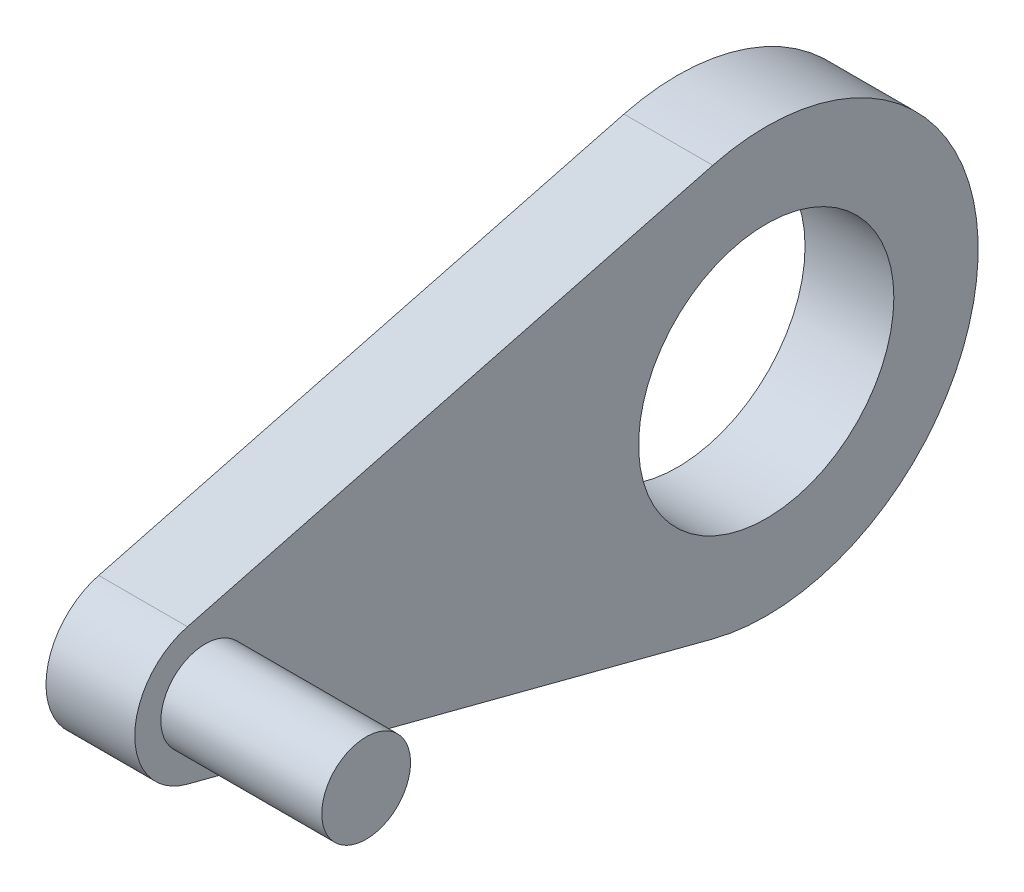
ISO-10303-21;
HEADER;
FILE_DESCRIPTION(('STEP AP214'),'2;1');
FILE_NAME('part.step','',(''),(''),'','','');
FILE_SCHEMA(('AUTOMOTIVE_DESIGN { 1 0 10303 214 1 1 1 1 }'));
ENDSEC;
DATA;
#1=APPLICATION_CONTEXT('core data for automotive mechanical design processes');
#2=APPLICATION_PROTOCOL_DEFINITION('international standard','automotive_design',2000,#1);
#3=PRODUCT_CONTEXT('',#1,'mechanical');
#4=PRODUCT('Part','Part','',(#3));
#5=PRODUCT_RELATED_PRODUCT_CATEGORY('part','',(#4));
#6=PRODUCT_DEFINITION_FORMATION('','',#4);
#7=PRODUCT_DEFINITION_CONTEXT('part definition',#1,'design');
#8=PRODUCT_DEFINITION('design','',#6,#7);
#9=PRODUCT_DEFINITION_SHAPE('','',#8);
#10=(LENGTH_UNIT() NAMED_UNIT(*) SI_UNIT(.MILLI.,.METRE.));
#11=(NAMED_UNIT(*) PLANE_ANGLE_UNIT() SI_UNIT($,.RADIAN.));
#12=(NAMED_UNIT(*) SI_UNIT($,.STERADIAN.) SOLID_ANGLE_UNIT());
#13=UNCERTAINTY_MEASURE_WITH_UNIT(LENGTH_MEASURE(1.E-05),#10,'distance_accuracy_value','');
#14=(GEOMETRIC_REPRESENTATION_CONTEXT(3) GLOBAL_UNCERTAINTY_ASSIGNED_CONTEXT((#13)) GLOBAL_UNIT_ASSIGNED_CONTEXT((#10,
#11,#12)) REPRESENTATION_CONTEXT('',''));
#15=CARTESIAN_POINT('',(0.,0.,0.));
#16=DIRECTION('',(0.,0.,1.));
#17=DIRECTION('',(1.,0.,0.));
#18=AXIS2_PLACEMENT_3D('',#15,#16,#17);
#19=CARTESIAN_POINT('',(0.,0.,0.));
#20=DIRECTION('',(1.,0.,0.));
#21=DIRECTION('',(0.,0.,-1.));
#22=AXIS2_PLACEMENT_3D('',#19,#20,#21);
#23=PLANE('',#22);
#24=CARTESIAN_POINT('',(0.,0.,-101.1));
#25=DIRECTION('',(1.,0.,0.));
#26=DIRECTION('',(0.,0.,-1.));
#27=AXIS2_PLACEMENT_3D('',#24,#25,#26);
#28=CIRCLE('',#27,23.);
#29=CARTESIAN_POINT('',(0.,0.,-124.1));
#30=VERTEX_POINT('',#29);
#31=EDGE_CURVE('E145',#30,#30,#28,.T.);
#32=ORIENTED_EDGE('',*,*,#31,.F.);
#33=EDGE_LOOP('',(#32));
#34=FACE_BOUND('',#33,.T.);
#35=CARTESIAN_POINT('',(0.,0.,0.));
#36=DIRECTION('',(1.,0.,0.));
#37=DIRECTION('',(0.,0.,-1.));
#38=AXIS2_PLACEMENT_3D('',#35,#36,#37);
#39=CIRCLE('',#38,12.7);
#40=CARTESIAN_POINT('',(0.,12.2893896975387,3.20326409495549));
#41=VERTEX_POINT('',#40);
#42=CARTESIAN_POINT('',(0.,-12.2893896975386,3.20326409495549));
#43=VERTEX_POINT('',#42);
#44=EDGE_CURVE('E98',#41,#43,#39,.T.);
#45=ORIENTED_EDGE('',*,*,#44,.T.);
#46=DIRECTION('',(0.,-0.252225519287834,-0.967668480121153));
#47=VECTOR('',#46,1.);
#48=CARTESIAN_POINT('',(0.,-36.9649359406281,-91.4649851632047));
#49=LINE('',#48,#47);
#50=CARTESIAN_POINT('',(0.,-36.9649359406281,-91.4649851632047));
#51=VERTEX_POINT('',#50);
#52=EDGE_CURVE('E101',#43,#51,#49,.T.);
#53=ORIENTED_EDGE('',*,*,#52,.T.);
#54=CARTESIAN_POINT('',(0.,0.,-101.1));
#55=DIRECTION('',(1.,0.,0.));
#56=DIRECTION('',(0.,0.,-1.));
#57=AXIS2_PLACEMENT_3D('',#54,#55,#56);
#58=CIRCLE('',#57,38.2);
#59=CARTESIAN_POINT('',(0.,36.9649359406281,-91.4649851632047));
#60=VERTEX_POINT('',#59);
#61=EDGE_CURVE('E83',#51,#60,#58,.T.);
#62=ORIENTED_EDGE('',*,*,#61,.T.);
#63=DIRECTION('',(0.,-0.252225519287834,0.967668480121153));
#64=VECTOR('',#63,1.);
#65=CARTESIAN_POINT('',(0.,12.2893896975387,3.20326409495549));
#66=LINE('',#65,#64);
#67=EDGE_CURVE('E93',#60,#41,#66,.T.);
#68=ORIENTED_EDGE('',*,*,#67,.T.);
#69=EDGE_LOOP('',(#45,#53,#62,#68));
#70=FACE_BOUND('',#69,.T.);
#71=CARTESIAN_POINT('',(0.,0.,0.));
#72=DIRECTION('',(1.,0.,0.));
#73=DIRECTION('',(0.,0.,-1.));
#74=AXIS2_PLACEMENT_3D('',#71,#72,#73);
#75=CIRCLE('',#74,8.);
#76=CARTESIAN_POINT('',(0.,0.,8.));
#77=VERTEX_POINT('',#76);
#78=EDGE_CURVE('E147',#77,#77,#75,.T.);
#79=ORIENTED_EDGE('',*,*,#78,.F.);
#80=EDGE_LOOP('',(#79));
#81=FACE_BOUND('',#80,.T.);
#82=ADVANCED_FACE('F32',(#34,#70,#81),#23,.T.);
#83=CARTESIAN_POINT('',(-16.,0.,0.));
#84=DIRECTION('',(1.,0.,0.));
#85=DIRECTION('',(0.,0.,-1.));
#86=AXIS2_PLACEMENT_3D('',#83,#84,#85);
#87=CYLINDRICAL_SURFACE('',#86,12.7);
#88=ORIENTED_EDGE('',*,*,#44,.F.);
#89=DIRECTION('',(1.,0.,0.));
#90=VECTOR('',#89,1.);
#91=CARTESIAN_POINT('',(-16.,12.2893896975387,3.20326409495549));
#92=LINE('',#91,#90);
#93=CARTESIAN_POINT('',(-16.,12.2893896975387,3.20326409495549));
#94=VERTEX_POINT('',#93);
#95=EDGE_CURVE('E11',#94,#41,#92,.T.);
#96=ORIENTED_EDGE('',*,*,#95,.F.);
#97=CARTESIAN_POINT('',(-16.,0.,0.));
#98=DIRECTION('',(1.,0.,0.));
#99=DIRECTION('',(0.,0.,-1.));
#100=AXIS2_PLACEMENT_3D('',#97,#98,#99);
#101=CIRCLE('',#100,12.7);
#102=CARTESIAN_POINT('',(-16.,-12.2893896975386,3.20326409495549));
#103=VERTEX_POINT('',#102);
#104=EDGE_CURVE('E91',#94,#103,#101,.T.);
#105=ORIENTED_EDGE('',*,*,#104,.T.);
#106=DIRECTION('',(1.,0.,0.));
#107=VECTOR('',#106,1.);
#108=CARTESIAN_POINT('',(-16.,-12.2893896975386,3.20326409495549));
#109=LINE('',#108,#107);
#110=EDGE_CURVE('E36',#103,#43,#109,.T.);
#111=ORIENTED_EDGE('',*,*,#110,.T.);
#112=EDGE_LOOP('',(#88,#96,#105,#111));
#113=FACE_BOUND('',#112,.T.);
#114=ADVANCED_FACE('F34',(#113),#87,.T.);
#115=CARTESIAN_POINT('',(-16.,12.2893896975387,3.20326409495549));
#116=DIRECTION('',(0.,0.967668480121153,0.252225519287834));
#117=DIRECTION('',(0.,-0.252225519287834,0.967668480121153));
#118=AXIS2_PLACEMENT_3D('',#115,#116,#117);
#119=PLANE('',#118);
#120=ORIENTED_EDGE('',*,*,#67,.F.);
#121=DIRECTION('',(1.,0.,0.));
#122=VECTOR('',#121,1.);
#123=CARTESIAN_POINT('',(-16.,36.9649359406281,-91.4649851632047));
#124=LINE('',#123,#122);
#125=CARTESIAN_POINT('',(-16.,36.9649359406281,-91.4649851632047));
#126=VERTEX_POINT('',#125);
#127=EDGE_CURVE('E42',#126,#60,#124,.T.);
#128=ORIENTED_EDGE('',*,*,#127,.F.);
#129=DIRECTION('',(0.,-0.252225519287834,0.967668480121153));
#130=VECTOR('',#129,1.);
#131=CARTESIAN_POINT('',(-16.,12.2893896975387,3.20326409495549));
#132=LINE('',#131,#130);
#133=EDGE_CURVE('E88',#126,#94,#132,.T.);
#134=ORIENTED_EDGE('',*,*,#133,.T.);
#135=ORIENTED_EDGE('',*,*,#95,.T.);
#136=EDGE_LOOP('',(#120,#128,#134,#135));
#137=FACE_BOUND('',#136,.T.);
#138=ADVANCED_FACE('F109',(#137),#119,.T.);
#139=CARTESIAN_POINT('',(-16.,0.,-101.1));
#140=DIRECTION('',(1.,0.,0.));
#141=DIRECTION('',(0.,0.,-1.));
#142=AXIS2_PLACEMENT_3D('',#139,#140,#141);
#143=CYLINDRICAL_SURFACE('',#142,38.2);
#144=ORIENTED_EDGE('',*,*,#61,.F.);
#145=DIRECTION('',(1.,0.,0.));
#146=VECTOR('',#145,1.);
#147=CARTESIAN_POINT('',(-16.,-36.9649359406281,-91.4649851632047));
#148=LINE('',#147,#146);
#149=CARTESIAN_POINT('',(-16.,-36.9649359406281,-91.4649851632047));
#150=VERTEX_POINT('',#149);
#151=EDGE_CURVE('E78',#150,#51,#148,.T.);
#152=ORIENTED_EDGE('',*,*,#151,.F.);
#153=CARTESIAN_POINT('',(-16.,0.,-101.1));
#154=DIRECTION('',(1.,0.,0.));
#155=DIRECTION('',(0.,0.,-1.));
#156=AXIS2_PLACEMENT_3D('',#153,#154,#155);
#157=CIRCLE('',#156,38.2);
#158=EDGE_CURVE('E81',#150,#126,#157,.T.);
#159=ORIENTED_EDGE('',*,*,#158,.T.);
#160=ORIENTED_EDGE('',*,*,#127,.T.);
#161=EDGE_LOOP('',(#144,#152,#159,#160));
#162=FACE_BOUND('',#161,.T.);
#163=ADVANCED_FACE('F80',(#162),#143,.T.);
#164=CARTESIAN_POINT('',(-16.,-36.9649359406281,-91.4649851632047));
#165=DIRECTION('',(0.,-0.967668480121153,0.252225519287834));
#166=DIRECTION('',(0.,-0.252225519287834,-0.967668480121153));
#167=AXIS2_PLACEMENT_3D('',#164,#165,#166);
#168=PLANE('',#167);
#169=ORIENTED_EDGE('',*,*,#52,.F.);
#170=ORIENTED_EDGE('',*,*,#110,.F.);
#171=DIRECTION('',(0.,-0.252225519287834,-0.967668480121153));
#172=VECTOR('',#171,1.);
#173=CARTESIAN_POINT('',(-16.,-36.9649359406281,-91.4649851632047));
#174=LINE('',#173,#172);
#175=EDGE_CURVE('E87',#103,#150,#174,.T.);
#176=ORIENTED_EDGE('',*,*,#175,.T.);
#177=ORIENTED_EDGE('',*,*,#151,.T.);
#178=EDGE_LOOP('',(#169,#170,#176,#177));
#179=FACE_BOUND('',#178,.T.);
#180=ADVANCED_FACE('F90',(#179),#168,.T.);
#181=CARTESIAN_POINT('',(-16.,0.,0.));
#182=DIRECTION('',(1.,0.,0.));
#183=DIRECTION('',(0.,0.,-1.));
#184=AXIS2_PLACEMENT_3D('',#181,#182,#183);
#185=PLANE('',#184);
#186=CARTESIAN_POINT('',(-16.,0.,-101.1));
#187=DIRECTION('',(1.,0.,0.));
#188=DIRECTION('',(0.,0.,-1.));
#189=AXIS2_PLACEMENT_3D('',#186,#187,#188);
#190=CIRCLE('',#189,23.);
#191=CARTESIAN_POINT('',(-16.,0.,-124.1));
#192=VERTEX_POINT('',#191);
#193=EDGE_CURVE('E143',#192,#192,#190,.T.);
#194=ORIENTED_EDGE('',*,*,#193,.T.);
#195=EDGE_LOOP('',(#194));
#196=FACE_BOUND('',#195,.T.);
#197=ORIENTED_EDGE('',*,*,#104,.F.);
#198=ORIENTED_EDGE('',*,*,#133,.F.);
#199=ORIENTED_EDGE('',*,*,#158,.F.);
#200=ORIENTED_EDGE('',*,*,#175,.F.);
#201=EDGE_LOOP('',(#197,#198,#199,#200));
#202=FACE_BOUND('',#201,.T.);
#203=ADVANCED_FACE('F86',(#196,#202),#185,.F.);
#204=CARTESIAN_POINT('',(29.,0.,0.));
#205=DIRECTION('',(-1.,0.,0.));
#206=DIRECTION('',(0.,0.,1.));
#207=AXIS2_PLACEMENT_3D('',#204,#205,#206);
#208=CYLINDRICAL_SURFACE('',#207,8.);
#209=CARTESIAN_POINT('',(29.,0.,0.));
#210=DIRECTION('',(1.,0.,0.));
#211=DIRECTION('',(0.,0.,-1.));
#212=AXIS2_PLACEMENT_3D('',#209,#210,#211);
#213=CIRCLE('',#212,8.);
#214=CARTESIAN_POINT('',(29.,0.,8.));
#215=VERTEX_POINT('',#214);
#216=EDGE_CURVE('E102',#215,#215,#213,.T.);
#217=CARTESIAN_POINT('',(29.,0.,8.));
#218=CARTESIAN_POINT('',(28.6979166666667,0.,8.));
#219=CARTESIAN_POINT('',(28.3958333333333,0.,8.));
#220=CARTESIAN_POINT('',(27.7916666666667,0.,8.));
#221=CARTESIAN_POINT('',(27.4895833333333,0.,8.));
#222=CARTESIAN_POINT('',(26.8854166666667,0.,8.));
#223=CARTESIAN_POINT('',(26.5833333333333,0.,8.));
#224=CARTESIAN_POINT('',(25.9791666666667,0.,8.));
#225=CARTESIAN_POINT('',(25.6770833333333,0.,8.));
#226=CARTESIAN_POINT('',(25.0729166666667,0.,8.));
#227=CARTESIAN_POINT('',(24.7708333333333,0.,8.));
#228=CARTESIAN_POINT('',(24.1666666666667,0.,8.));
#229=CARTESIAN_POINT('',(23.8645833333333,0.,8.));
#230=CARTESIAN_POINT('',(23.2604166666667,0.,8.));
#231=CARTESIAN_POINT('',(22.9583333333333,0.,8.));
#232=CARTESIAN_POINT('',(22.3541666666667,0.,8.));
#233=CARTESIAN_POINT('',(22.0520833333333,0.,8.));
#234=CARTESIAN_POINT('',(21.4479166666667,0.,8.));
#235=CARTESIAN_POINT('',(21.1458333333333,0.,8.));
#236=CARTESIAN_POINT('',(20.5416666666667,0.,8.));
#237=CARTESIAN_POINT('',(20.2395833333333,0.,8.));
#238=CARTESIAN_POINT('',(19.6354166666667,0.,8.));
#239=CARTESIAN_POINT('',(19.3333333333333,0.,8.));
#240=CARTESIAN_POINT('',(18.7291666666667,0.,8.));
#241=CARTESIAN_POINT('',(18.4270833333333,0.,8.));
#242=CARTESIAN_POINT('',(17.8229166666667,0.,8.));
#243=CARTESIAN_POINT('',(17.5208333333333,0.,8.));
#244=CARTESIAN_POINT('',(16.9166666666667,0.,8.));
#245=CARTESIAN_POINT('',(16.6145833333333,0.,8.));
#246=CARTESIAN_POINT('',(16.0104166666667,0.,8.));
#247=CARTESIAN_POINT('',(15.7083333333333,0.,8.));
#248=CARTESIAN_POINT('',(15.1041666666667,0.,8.));
#249=CARTESIAN_POINT('',(14.8020833333333,0.,8.));
#250=CARTESIAN_POINT('',(14.1979166666667,0.,8.));
#251=CARTESIAN_POINT('',(13.8958333333333,0.,8.));
#252=CARTESIAN_POINT('',(13.2916666666667,0.,8.));
#253=CARTESIAN_POINT('',(12.9895833333333,0.,8.));
#254=CARTESIAN_POINT('',(12.3854166666667,0.,8.));
#255=CARTESIAN_POINT('',(12.0833333333333,0.,8.));
#256=CARTESIAN_POINT('',(11.4791666666667,0.,8.));
#257=CARTESIAN_POINT('',(11.1770833333333,0.,8.));
#258=CARTESIAN_POINT('',(10.5729166666667,0.,8.));
#259=CARTESIAN_POINT('',(10.2708333333333,0.,8.));
#260=CARTESIAN_POINT('',(9.66666666666667,0.,8.));
#261=CARTESIAN_POINT('',(9.36458333333333,0.,8.));
#262=CARTESIAN_POINT('',(8.76041666666667,0.,8.));
#263=CARTESIAN_POINT('',(8.45833333333333,0.,8.));
#264=CARTESIAN_POINT('',(7.85416666666667,0.,8.));
#265=CARTESIAN_POINT('',(7.55208333333333,0.,8.));
#266=CARTESIAN_POINT('',(6.94791666666667,0.,8.));
#267=CARTESIAN_POINT('',(6.64583333333333,0.,8.));
#268=CARTESIAN_POINT('',(6.04166666666667,0.,8.));
#269=CARTESIAN_POINT('',(5.73958333333333,0.,8.));
#270=CARTESIAN_POINT('',(5.13541666666667,0.,8.));
#271=CARTESIAN_POINT('',(4.83333333333333,0.,8.));
#272=CARTESIAN_POINT('',(4.22916666666667,0.,8.));
#273=CARTESIAN_POINT('',(3.92708333333333,0.,8.));
#274=CARTESIAN_POINT('',(3.32291666666667,0.,8.));
#275=CARTESIAN_POINT('',(3.02083333333333,0.,8.));
#276=CARTESIAN_POINT('',(2.41666666666667,0.,8.));
#277=CARTESIAN_POINT('',(2.11458333333333,0.,8.));
#278=CARTESIAN_POINT('',(1.51041666666667,0.,8.));
#279=CARTESIAN_POINT('',(1.20833333333333,0.,8.));
#280=CARTESIAN_POINT('',(0.604166666666667,0.,8.));
#281=CARTESIAN_POINT('',(0.302083333333333,0.,8.));
#282=CARTESIAN_POINT('',(0.,0.,8.));
#283=B_SPLINE_CURVE_WITH_KNOTS('',3,(#217,#218,#219,#220,#221,#222,#223,#224,#225,#226,#227,
#228,#229,#230,#231,#232,#233,#234,#235,#236,#237,#238,#239,#240,#241,#242,#243,#244,#245,#246,
#247,#248,#249,#250,#251,#252,#253,#254,#255,#256,#257,#258,#259,#260,#261,#262,#263,#264,#265,
#266,#267,#268,#269,#270,#271,#272,#273,#274,#275,#276,#277,#278,#279,#280,#281,#282),
.UNSPECIFIED.,.F.,.F.,(4,2,2,2,2,2,2,2,2,2,2,2,2,2,2,2,2,2,2,2,2,2,2,2,2,2,2,2,2,2,2,2,4),(0.,
0.906250000000001,1.8125,2.71875,3.625,4.53125,5.4375,6.34375,7.25,8.15625,9.0625,9.96875,
10.875,11.78125,12.6875,13.59375,14.5,15.40625,16.3125,17.21875,18.125,19.03125,19.9375,
20.84375,21.75,22.65625,23.5625,24.46875,25.375,26.28125,27.1875,28.09375,29.),.UNSPECIFIED.);
#284=EDGE_CURVE('BSEAM126',#215,#77,#283,.T.);
#285=ORIENTED_EDGE('',*,*,#216,.F.);
#286=ORIENTED_EDGE('',*,*,#78,.T.);
#287=ORIENTED_EDGE('',*,*,#284,.T.);
#288=ORIENTED_EDGE('',*,*,#284,.F.);
#289=EDGE_LOOP('',(#285,#287,#286,#288));
#290=FACE_BOUND('',#289,.T.);
#291=ADVANCED_FACE('F126',(#290),#208,.T.);
#292=CARTESIAN_POINT('',(29.,0.,0.));
#293=DIRECTION('',(1.,0.,0.));
#294=DIRECTION('',(0.,0.,-1.));
#295=AXIS2_PLACEMENT_3D('',#292,#293,#294);
#296=PLANE('',#295);
#297=ORIENTED_EDGE('',*,*,#216,.T.);
#298=EDGE_LOOP('',(#297));
#299=FACE_BOUND('',#298,.T.);
#300=ADVANCED_FACE('F130',(#299),#296,.T.);
#301=CARTESIAN_POINT('',(-16.,0.,-101.1));
#302=DIRECTION('',(1.,0.,0.));
#303=DIRECTION('',(0.,0.,-1.));
#304=AXIS2_PLACEMENT_3D('',#301,#302,#303);
#305=CYLINDRICAL_SURFACE('',#304,23.);
#306=ORIENTED_EDGE('',*,*,#193,.F.);
#307=EDGE_LOOP('',(#306));
#308=FACE_BOUND('',#307,.T.);
#309=ORIENTED_EDGE('',*,*,#31,.T.);
#310=EDGE_LOOP('',(#309));
#311=FACE_BOUND('',#310,.T.);
#312=ADVANCED_FACE('F134',(#308,#311),#305,.F.);
#313=CLOSED_SHELL('',(#82,#114,#138,#163,#180,#203,#291,#300,#312));
#314=MANIFOLD_SOLID_BREP('B2',#313);
#315=ADVANCED_BREP_SHAPE_REPRESENTATION('',(#18,#314),#14);
#316=SHAPE_DEFINITION_REPRESENTATION(#9,#315);
ENDSEC;
END-ISO-10303-21;
